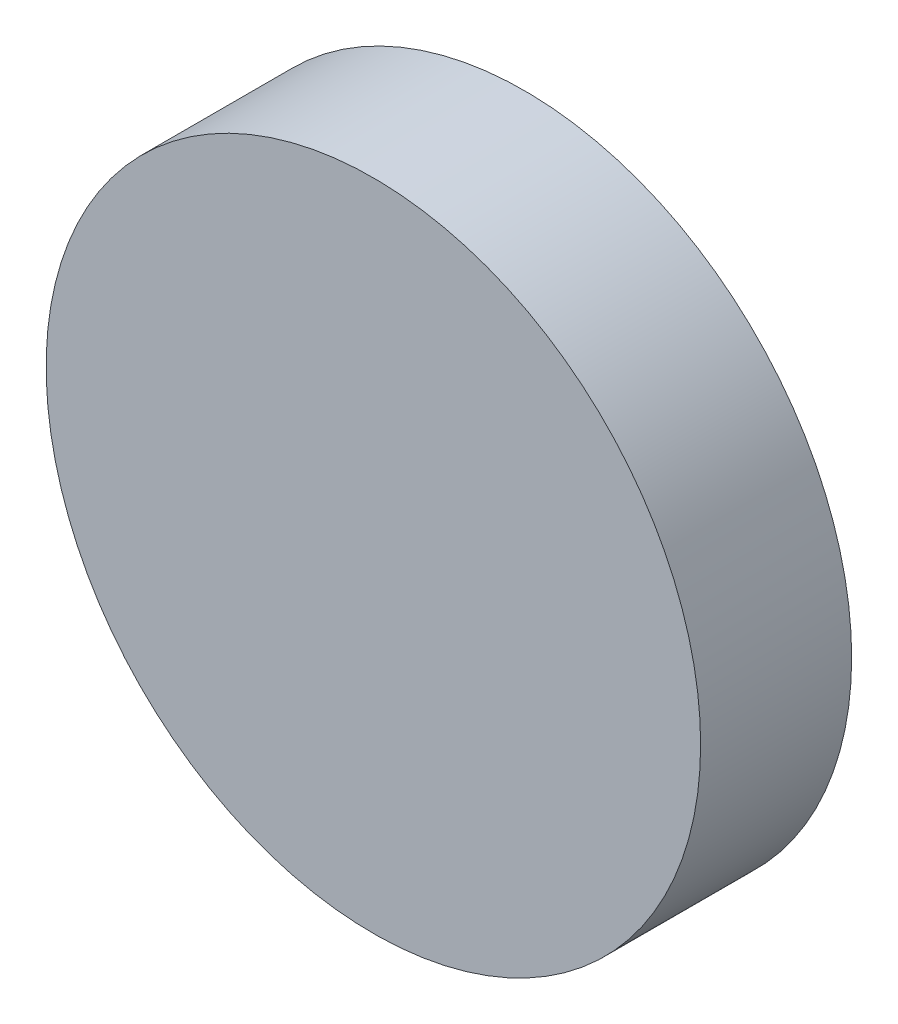
ISO-10303-21;
HEADER;
FILE_DESCRIPTION(('STEP AP214'),'2;1');
FILE_NAME('part.step','',(''),(''),'','','');
FILE_SCHEMA(('AUTOMOTIVE_DESIGN { 1 0 10303 214 1 1 1 1 }'));
ENDSEC;
DATA;
#1=APPLICATION_CONTEXT('core data for automotive mechanical design processes');
#2=APPLICATION_PROTOCOL_DEFINITION('international standard','automotive_design',2000,#1);
#3=PRODUCT_CONTEXT('',#1,'mechanical');
#4=PRODUCT('Part','Part','',(#3));
#5=PRODUCT_RELATED_PRODUCT_CATEGORY('part','',(#4));
#6=PRODUCT_DEFINITION_FORMATION('','',#4);
#7=PRODUCT_DEFINITION_CONTEXT('part definition',#1,'design');
#8=PRODUCT_DEFINITION('design','',#6,#7);
#9=PRODUCT_DEFINITION_SHAPE('','',#8);
#10=(LENGTH_UNIT() NAMED_UNIT(*) SI_UNIT(.MILLI.,.METRE.));
#11=(NAMED_UNIT(*) PLANE_ANGLE_UNIT() SI_UNIT($,.RADIAN.));
#12=(NAMED_UNIT(*) SI_UNIT($,.STERADIAN.) SOLID_ANGLE_UNIT());
#13=UNCERTAINTY_MEASURE_WITH_UNIT(LENGTH_MEASURE(1.E-05),#10,'distance_accuracy_value','');
#14=(GEOMETRIC_REPRESENTATION_CONTEXT(3) GLOBAL_UNCERTAINTY_ASSIGNED_CONTEXT((#13)) GLOBAL_UNIT_ASSIGNED_CONTEXT((#10,
#11,#12)) REPRESENTATION_CONTEXT('',''));
#15=CARTESIAN_POINT('',(0.,0.,0.));
#16=DIRECTION('',(0.,0.,1.));
#17=DIRECTION('',(1.,0.,0.));
#18=AXIS2_PLACEMENT_3D('',#15,#16,#17);
#19=CARTESIAN_POINT('',(0.,0.,15.));
#20=DIRECTION('',(0.,0.,-1.));
#21=DIRECTION('',(-1.,0.,0.));
#22=AXIS2_PLACEMENT_3D('',#19,#20,#21);
#23=CYLINDRICAL_SURFACE('',#22,32.5);
#24=CARTESIAN_POINT('',(0.,0.,15.));
#25=DIRECTION('',(0.,0.,1.));
#26=DIRECTION('',(1.,0.,0.));
#27=AXIS2_PLACEMENT_3D('',#24,#25,#26);
#28=CIRCLE('',#27,32.5);
#29=CARTESIAN_POINT('',(32.5,0.,15.));
#30=VERTEX_POINT('',#29);
#31=EDGE_CURVE('E10',#30,#30,#28,.T.);
#32=ORIENTED_EDGE('',*,*,#31,.F.);
#33=EDGE_LOOP('',(#32));
#34=FACE_BOUND('',#33,.T.);
#35=CARTESIAN_POINT('',(0.,0.,0.));
#36=DIRECTION('',(0.,0.,1.));
#37=DIRECTION('',(1.,0.,0.));
#38=AXIS2_PLACEMENT_3D('',#35,#36,#37);
#39=CIRCLE('',#38,32.5);
#40=CARTESIAN_POINT('',(32.5,0.,0.));
#41=VERTEX_POINT('',#40);
#42=EDGE_CURVE('E34',#41,#41,#39,.T.);
#43=ORIENTED_EDGE('',*,*,#42,.T.);
#44=EDGE_LOOP('',(#43));
#45=FACE_BOUND('',#44,.T.);
#46=ADVANCED_FACE('F31',(#34,#45),#23,.T.);
#47=CARTESIAN_POINT('',(0.,0.,15.));
#48=DIRECTION('',(0.,0.,1.));
#49=DIRECTION('',(1.,0.,0.));
#50=AXIS2_PLACEMENT_3D('',#47,#48,#49);
#51=PLANE('',#50);
#52=ORIENTED_EDGE('',*,*,#31,.T.);
#53=EDGE_LOOP('',(#52));
#54=FACE_BOUND('',#53,.T.);
#55=ADVANCED_FACE('F46',(#54),#51,.T.);
#56=CARTESIAN_POINT('',(0.,0.,0.));
#57=DIRECTION('',(0.,0.,1.));
#58=DIRECTION('',(1.,0.,0.));
#59=AXIS2_PLACEMENT_3D('',#56,#57,#58);
#60=PLANE('',#59);
#61=ORIENTED_EDGE('',*,*,#42,.F.);
#62=EDGE_LOOP('',(#61));
#63=FACE_BOUND('',#62,.T.);
#64=ADVANCED_FACE('F44',(#63),#60,.F.);
#65=CLOSED_SHELL('',(#46,#55,#64));
#66=MANIFOLD_SOLID_BREP('B2',#65);
#67=ADVANCED_BREP_SHAPE_REPRESENTATION('',(#18,#66),#14);
#68=SHAPE_DEFINITION_REPRESENTATION(#9,#67);
ENDSEC;
END-ISO-10303-21;
